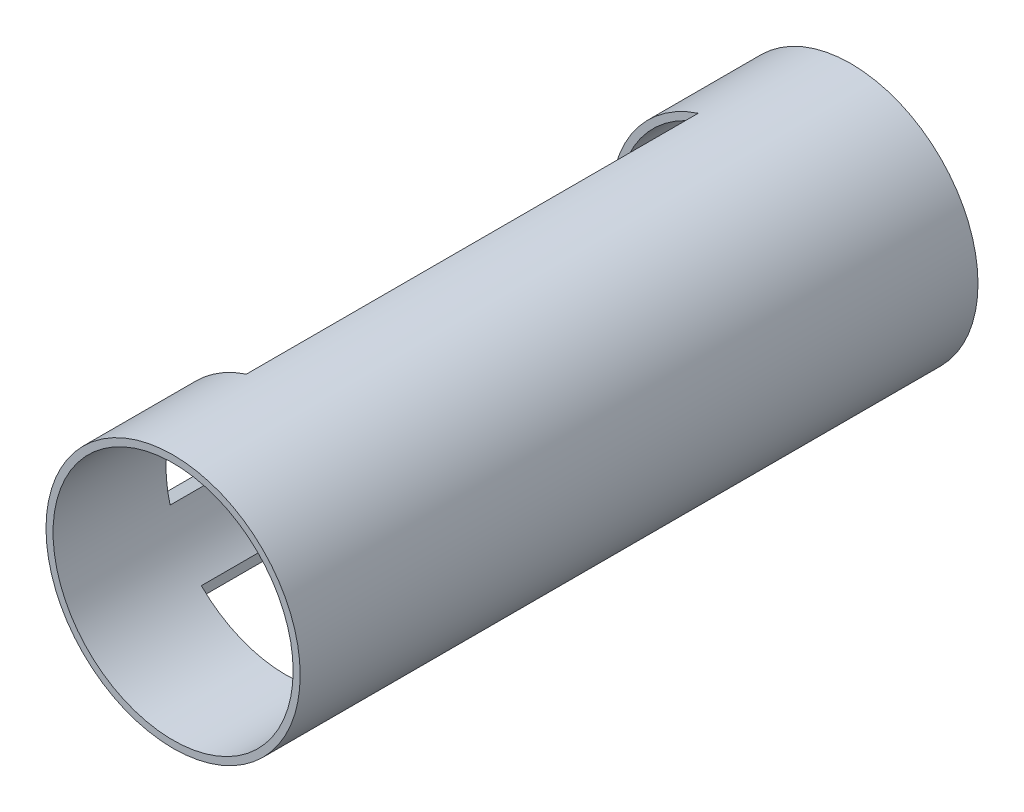
ISO-10303-21;
HEADER;
FILE_DESCRIPTION(('STEP AP214'),'2;1');
FILE_NAME('part.step','',(''),(''),'','','');
FILE_SCHEMA(('AUTOMOTIVE_DESIGN { 1 0 10303 214 1 1 1 1 }'));
ENDSEC;
DATA;
#1=APPLICATION_CONTEXT('core data for automotive mechanical design processes');
#2=APPLICATION_PROTOCOL_DEFINITION('international standard','automotive_design',2000,#1);
#3=PRODUCT_CONTEXT('',#1,'mechanical');
#4=PRODUCT('Part','Part','',(#3));
#5=PRODUCT_RELATED_PRODUCT_CATEGORY('part','',(#4));
#6=PRODUCT_DEFINITION_FORMATION('','',#4);
#7=PRODUCT_DEFINITION_CONTEXT('part definition',#1,'design');
#8=PRODUCT_DEFINITION('design','',#6,#7);
#9=PRODUCT_DEFINITION_SHAPE('','',#8);
#10=(LENGTH_UNIT() NAMED_UNIT(*) SI_UNIT(.MILLI.,.METRE.));
#11=(NAMED_UNIT(*) PLANE_ANGLE_UNIT() SI_UNIT($,.RADIAN.));
#12=(NAMED_UNIT(*) SI_UNIT($,.STERADIAN.) SOLID_ANGLE_UNIT());
#13=UNCERTAINTY_MEASURE_WITH_UNIT(LENGTH_MEASURE(1.E-05),#10,'distance_accuracy_value','');
#14=(GEOMETRIC_REPRESENTATION_CONTEXT(3) GLOBAL_UNCERTAINTY_ASSIGNED_CONTEXT((#13)) GLOBAL_UNIT_ASSIGNED_CONTEXT((#10,
#11,#12)) REPRESENTATION_CONTEXT('',''));
#15=CARTESIAN_POINT('',(0.,0.,0.));
#16=DIRECTION('',(0.,0.,1.));
#17=DIRECTION('',(1.,0.,0.));
#18=AXIS2_PLACEMENT_3D('',#15,#16,#17);
#19=CARTESIAN_POINT('',(0.,0.,304.8));
#20=DIRECTION('',(0.,0.,1.));
#21=DIRECTION('',(1.,0.,0.));
#22=AXIS2_PLACEMENT_3D('',#19,#20,#21);
#23=PLANE('',#22);
#24=CARTESIAN_POINT('',(0.,0.,304.8));
#25=DIRECTION('',(0.,0.,1.));
#26=DIRECTION('',(1.,0.,0.));
#27=AXIS2_PLACEMENT_3D('',#24,#25,#26);
#28=CIRCLE('',#27,57.15);
#29=CARTESIAN_POINT('',(57.15,0.,304.8));
#30=VERTEX_POINT('',#29);
#31=EDGE_CURVE('E144',#30,#30,#28,.T.);
#32=ORIENTED_EDGE('',*,*,#31,.T.);
#33=EDGE_LOOP('',(#32));
#34=FACE_BOUND('',#33,.T.);
#35=CARTESIAN_POINT('',(0.,0.,304.8));
#36=DIRECTION('',(0.,0.,1.));
#37=DIRECTION('',(1.,0.,0.));
#38=AXIS2_PLACEMENT_3D('',#35,#36,#37);
#39=CIRCLE('',#38,53.975);
#40=CARTESIAN_POINT('',(53.975,0.,304.8));
#41=VERTEX_POINT('',#40);
#42=EDGE_CURVE('E138',#41,#41,#39,.T.);
#43=ORIENTED_EDGE('',*,*,#42,.F.);
#44=EDGE_LOOP('',(#43));
#45=FACE_BOUND('',#44,.T.);
#46=ADVANCED_FACE('F32',(#34,#45),#23,.T.);
#47=CARTESIAN_POINT('',(0.,0.,0.));
#48=DIRECTION('',(0.,0.,1.));
#49=DIRECTION('',(1.,0.,0.));
#50=AXIS2_PLACEMENT_3D('',#47,#48,#49);
#51=PLANE('',#50);
#52=CARTESIAN_POINT('',(0.,0.,0.));
#53=DIRECTION('',(0.,0.,1.));
#54=DIRECTION('',(1.,0.,0.));
#55=AXIS2_PLACEMENT_3D('',#52,#53,#54);
#56=CIRCLE('',#55,57.15);
#57=CARTESIAN_POINT('',(57.15,0.,0.));
#58=VERTEX_POINT('',#57);
#59=EDGE_CURVE('E141',#58,#58,#56,.T.);
#60=ORIENTED_EDGE('',*,*,#59,.F.);
#61=EDGE_LOOP('',(#60));
#62=FACE_BOUND('',#61,.T.);
#63=CARTESIAN_POINT('',(0.,0.,0.));
#64=DIRECTION('',(0.,0.,1.));
#65=DIRECTION('',(1.,0.,0.));
#66=AXIS2_PLACEMENT_3D('',#63,#64,#65);
#67=CIRCLE('',#66,53.975);
#68=CARTESIAN_POINT('',(53.975,0.,0.));
#69=VERTEX_POINT('',#68);
#70=EDGE_CURVE('E137',#69,#69,#67,.T.);
#71=ORIENTED_EDGE('',*,*,#70,.T.);
#72=EDGE_LOOP('',(#71));
#73=FACE_BOUND('',#72,.T.);
#74=ADVANCED_FACE('F185',(#62,#73),#51,.F.);
#75=CARTESIAN_POINT('',(0.,0.,304.8));
#76=DIRECTION('',(0.,0.,-1.));
#77=DIRECTION('',(-1.,0.,0.));
#78=AXIS2_PLACEMENT_3D('',#75,#76,#77);
#79=CYLINDRICAL_SURFACE('',#78,57.15);
#80=DIRECTION('',(0.,0.,-1.));
#81=VECTOR('',#80,1.);
#82=CARTESIAN_POINT('',(-55.9401663726257,-11.6970203985014,304.8));
#83=LINE('',#82,#81);
#84=CARTESIAN_POINT('',(-55.9401663726257,-11.6970203985014,254.));
#85=VERTEX_POINT('',#84);
#86=CARTESIAN_POINT('',(-55.9401663726257,-11.6970203985014,50.8));
#87=VERTEX_POINT('',#86);
#88=EDGE_CURVE('E111',#85,#87,#83,.T.);
#89=ORIENTED_EDGE('',*,*,#88,.T.);
#90=CARTESIAN_POINT('',(0.,0.,50.8));
#91=DIRECTION('',(0.,0.,-1.));
#92=DIRECTION('',(-1.,0.,0.));
#93=AXIS2_PLACEMENT_3D('',#90,#91,#92);
#94=CIRCLE('',#93,57.15);
#95=CARTESIAN_POINT('',(-17.8401663726253,54.2941153698727,50.8));
#96=VERTEX_POINT('',#95);
#97=EDGE_CURVE('E104',#87,#96,#94,.T.);
#98=ORIENTED_EDGE('',*,*,#97,.T.);
#99=DIRECTION('',(0.,0.,-1.));
#100=VECTOR('',#99,1.);
#101=CARTESIAN_POINT('',(-17.8401663726253,54.2941153698727,304.8));
#102=LINE('',#101,#100);
#103=CARTESIAN_POINT('',(-17.8401663726253,54.2941153698727,254.));
#104=VERTEX_POINT('',#103);
#105=EDGE_CURVE('E93',#96,#104,#102,.F.);
#106=ORIENTED_EDGE('',*,*,#105,.T.);
#107=CARTESIAN_POINT('',(0.,0.,254.));
#108=DIRECTION('',(0.,0.,1.));
#109=DIRECTION('',(1.,0.,0.));
#110=AXIS2_PLACEMENT_3D('',#107,#108,#109);
#111=CIRCLE('',#110,57.15);
#112=EDGE_CURVE('E98',#104,#85,#111,.T.);
#113=ORIENTED_EDGE('',*,*,#112,.T.);
#114=EDGE_LOOP('',(#89,#98,#106,#113));
#115=FACE_BOUND('',#114,.T.);
#116=DIRECTION('',(0.,0.,-1.));
#117=VECTOR('',#116,1.);
#118=CARTESIAN_POINT('',(-38.1,-42.597094971371,304.8));
#119=LINE('',#118,#117);
#120=CARTESIAN_POINT('',(-38.1,-42.597094971371,50.8));
#121=VERTEX_POINT('',#120);
#122=CARTESIAN_POINT('',(-38.1,-42.597094971371,254.));
#123=VERTEX_POINT('',#122);
#124=EDGE_CURVE('E134',#121,#123,#119,.F.);
#125=ORIENTED_EDGE('',*,*,#124,.T.);
#126=CARTESIAN_POINT('',(0.,0.,254.));
#127=DIRECTION('',(0.,0.,1.));
#128=DIRECTION('',(1.,0.,0.));
#129=AXIS2_PLACEMENT_3D('',#126,#127,#128);
#130=CIRCLE('',#129,57.15);
#131=CARTESIAN_POINT('',(38.1,-42.597094971371,254.));
#132=VERTEX_POINT('',#131);
#133=EDGE_CURVE('E122',#123,#132,#130,.T.);
#134=ORIENTED_EDGE('',*,*,#133,.T.);
#135=DIRECTION('',(0.,0.,-1.));
#136=VECTOR('',#135,1.);
#137=CARTESIAN_POINT('',(38.1,-42.597094971371,304.8));
#138=LINE('',#137,#136);
#139=CARTESIAN_POINT('',(38.1,-42.597094971371,50.8));
#140=VERTEX_POINT('',#139);
#141=EDGE_CURVE('E129',#132,#140,#138,.T.);
#142=ORIENTED_EDGE('',*,*,#141,.T.);
#143=CARTESIAN_POINT('',(0.,0.,50.8));
#144=DIRECTION('',(0.,0.,-1.));
#145=DIRECTION('',(-1.,0.,0.));
#146=AXIS2_PLACEMENT_3D('',#143,#144,#145);
#147=CIRCLE('',#146,57.15);
#148=EDGE_CURVE('E132',#140,#121,#147,.T.);
#149=ORIENTED_EDGE('',*,*,#148,.T.);
#150=EDGE_LOOP('',(#125,#134,#142,#149));
#151=FACE_BOUND('',#150,.T.);
#152=ORIENTED_EDGE('',*,*,#31,.F.);
#153=EDGE_LOOP('',(#152));
#154=FACE_BOUND('',#153,.T.);
#155=ORIENTED_EDGE('',*,*,#59,.T.);
#156=EDGE_LOOP('',(#155));
#157=FACE_BOUND('',#156,.T.);
#158=ADVANCED_FACE('F34',(#115,#151,#154,#157),#79,.T.);
#159=CARTESIAN_POINT('',(0.,0.,304.8));
#160=DIRECTION('',(0.,0.,-1.));
#161=DIRECTION('',(-1.,0.,0.));
#162=AXIS2_PLACEMENT_3D('',#159,#160,#161);
#163=CYLINDRICAL_SURFACE('',#162,53.975);
#164=CARTESIAN_POINT('',(0.,0.,50.8));
#165=DIRECTION('',(0.,0.,-1.));
#166=DIRECTION('',(-1.,0.,0.));
#167=AXIS2_PLACEMENT_3D('',#164,#165,#166);
#168=CIRCLE('',#167,53.975);
#169=CARTESIAN_POINT('',(-52.1599376132001,-13.8795364903541,50.8));
#170=VERTEX_POINT('',#169);
#171=CARTESIAN_POINT('',(-14.0599376131998,52.11159927802,50.8));
#172=VERTEX_POINT('',#171);
#173=EDGE_CURVE('E11',#170,#172,#168,.T.);
#174=ORIENTED_EDGE('',*,*,#173,.F.);
#175=DIRECTION('',(0.,0.,-1.));
#176=VECTOR('',#175,1.);
#177=CARTESIAN_POINT('',(-52.1599376132001,-13.8795364903541,304.8));
#178=LINE('',#177,#176);
#179=CARTESIAN_POINT('',(-52.1599376132001,-13.8795364903541,254.));
#180=VERTEX_POINT('',#179);
#181=EDGE_CURVE('E40',#180,#170,#178,.T.);
#182=ORIENTED_EDGE('',*,*,#181,.F.);
#183=CARTESIAN_POINT('',(0.,0.,254.));
#184=DIRECTION('',(0.,0.,1.));
#185=DIRECTION('',(1.,0.,0.));
#186=AXIS2_PLACEMENT_3D('',#183,#184,#185);
#187=CIRCLE('',#186,53.975);
#188=CARTESIAN_POINT('',(-14.0599376131998,52.1115992780199,254.));
#189=VERTEX_POINT('',#188);
#190=EDGE_CURVE('E160',#189,#180,#187,.T.);
#191=ORIENTED_EDGE('',*,*,#190,.F.);
#192=DIRECTION('',(0.,0.,-1.));
#193=VECTOR('',#192,1.);
#194=CARTESIAN_POINT('',(-14.0599376131998,52.11159927802,304.8));
#195=LINE('',#194,#193);
#196=EDGE_CURVE('E158',#172,#189,#195,.F.);
#197=ORIENTED_EDGE('',*,*,#196,.F.);
#198=EDGE_LOOP('',(#174,#182,#191,#197));
#199=FACE_BOUND('',#198,.T.);
#200=DIRECTION('',(0.,0.,-1.));
#201=VECTOR('',#200,1.);
#202=CARTESIAN_POINT('',(-38.1,-38.2320627876655,304.8));
#203=LINE('',#202,#201);
#204=CARTESIAN_POINT('',(-38.1,-38.2320627876655,50.8));
#205=VERTEX_POINT('',#204);
#206=CARTESIAN_POINT('',(-38.1,-38.2320627876655,254.));
#207=VERTEX_POINT('',#206);
#208=EDGE_CURVE('E155',#205,#207,#203,.F.);
#209=ORIENTED_EDGE('',*,*,#208,.F.);
#210=CARTESIAN_POINT('',(0.,0.,50.8));
#211=DIRECTION('',(0.,0.,-1.));
#212=DIRECTION('',(-1.,0.,0.));
#213=AXIS2_PLACEMENT_3D('',#210,#211,#212);
#214=CIRCLE('',#213,53.975);
#215=CARTESIAN_POINT('',(38.1,-38.2320627876655,50.8));
#216=VERTEX_POINT('',#215);
#217=EDGE_CURVE('E153',#216,#205,#214,.T.);
#218=ORIENTED_EDGE('',*,*,#217,.F.);
#219=DIRECTION('',(0.,0.,-1.));
#220=VECTOR('',#219,1.);
#221=CARTESIAN_POINT('',(38.1,-38.2320627876655,304.8));
#222=LINE('',#221,#220);
#223=CARTESIAN_POINT('',(38.1,-38.2320627876655,254.));
#224=VERTEX_POINT('',#223);
#225=EDGE_CURVE('E151',#224,#216,#222,.T.);
#226=ORIENTED_EDGE('',*,*,#225,.F.);
#227=CARTESIAN_POINT('',(0.,0.,254.));
#228=DIRECTION('',(0.,0.,1.));
#229=DIRECTION('',(1.,0.,0.));
#230=AXIS2_PLACEMENT_3D('',#227,#228,#229);
#231=CIRCLE('',#230,53.975);
#232=EDGE_CURVE('E147',#207,#224,#231,.T.);
#233=ORIENTED_EDGE('',*,*,#232,.F.);
#234=EDGE_LOOP('',(#209,#218,#226,#233));
#235=FACE_BOUND('',#234,.T.);
#236=ORIENTED_EDGE('',*,*,#42,.T.);
#237=EDGE_LOOP('',(#236));
#238=FACE_BOUND('',#237,.T.);
#239=ORIENTED_EDGE('',*,*,#70,.F.);
#240=EDGE_LOOP('',(#239));
#241=FACE_BOUND('',#240,.T.);
#242=ADVANCED_FACE('F170',(#199,#235,#238,#241),#163,.F.);
#243=CARTESIAN_POINT('',(-38.1,-57.15,50.8));
#244=DIRECTION('',(-1.,0.,0.));
#245=DIRECTION('',(0.,0.,1.));
#246=AXIS2_PLACEMENT_3D('',#243,#244,#245);
#247=PLANE('',#246);
#248=DIRECTION('',(0.,1.,0.));
#249=VECTOR('',#248,1.);
#250=CARTESIAN_POINT('',(-38.1,-57.15,50.8));
#251=LINE('',#250,#249);
#252=EDGE_CURVE('E119',#121,#205,#251,.T.);
#253=ORIENTED_EDGE('',*,*,#252,.T.);
#254=ORIENTED_EDGE('',*,*,#208,.T.);
#255=DIRECTION('',(0.,1.,0.));
#256=VECTOR('',#255,1.);
#257=CARTESIAN_POINT('',(-38.1,-57.15,254.));
#258=LINE('',#257,#256);
#259=EDGE_CURVE('E112',#123,#207,#258,.T.);
#260=ORIENTED_EDGE('',*,*,#259,.F.);
#261=ORIENTED_EDGE('',*,*,#124,.F.);
#262=EDGE_LOOP('',(#253,#254,#260,#261));
#263=FACE_BOUND('',#262,.T.);
#264=ADVANCED_FACE('F196',(#263),#247,.F.);
#265=CARTESIAN_POINT('',(-38.1,-57.15,50.8));
#266=DIRECTION('',(0.,0.,-1.));
#267=DIRECTION('',(-1.,0.,0.));
#268=AXIS2_PLACEMENT_3D('',#265,#266,#267);
#269=PLANE('',#268);
#270=DIRECTION('',(0.,1.,0.));
#271=VECTOR('',#270,1.);
#272=CARTESIAN_POINT('',(38.1,-57.15,50.8));
#273=LINE('',#272,#271);
#274=EDGE_CURVE('E123',#140,#216,#273,.T.);
#275=ORIENTED_EDGE('',*,*,#274,.T.);
#276=ORIENTED_EDGE('',*,*,#217,.T.);
#277=ORIENTED_EDGE('',*,*,#252,.F.);
#278=ORIENTED_EDGE('',*,*,#148,.F.);
#279=EDGE_LOOP('',(#275,#276,#277,#278));
#280=FACE_BOUND('',#279,.T.);
#281=ADVANCED_FACE('F199',(#280),#269,.F.);
#282=CARTESIAN_POINT('',(38.1,-57.15,50.8));
#283=DIRECTION('',(1.,0.,0.));
#284=DIRECTION('',(0.,0.,-1.));
#285=AXIS2_PLACEMENT_3D('',#282,#283,#284);
#286=PLANE('',#285);
#287=DIRECTION('',(0.,1.,0.));
#288=VECTOR('',#287,1.);
#289=CARTESIAN_POINT('',(38.1,-57.15,254.));
#290=LINE('',#289,#288);
#291=EDGE_CURVE('E114',#132,#224,#290,.T.);
#292=ORIENTED_EDGE('',*,*,#291,.T.);
#293=ORIENTED_EDGE('',*,*,#225,.T.);
#294=ORIENTED_EDGE('',*,*,#274,.F.);
#295=ORIENTED_EDGE('',*,*,#141,.F.);
#296=EDGE_LOOP('',(#292,#293,#294,#295));
#297=FACE_BOUND('',#296,.T.);
#298=ADVANCED_FACE('F204',(#297),#286,.F.);
#299=CARTESIAN_POINT('',(-38.1,-57.15,254.));
#300=DIRECTION('',(0.,0.,1.));
#301=DIRECTION('',(1.,0.,0.));
#302=AXIS2_PLACEMENT_3D('',#299,#300,#301);
#303=PLANE('',#302);
#304=ORIENTED_EDGE('',*,*,#259,.T.);
#305=ORIENTED_EDGE('',*,*,#232,.T.);
#306=ORIENTED_EDGE('',*,*,#291,.F.);
#307=ORIENTED_EDGE('',*,*,#133,.F.);
#308=EDGE_LOOP('',(#304,#305,#306,#307));
#309=FACE_BOUND('',#308,.T.);
#310=ADVANCED_FACE('F201',(#309),#303,.F.);
#311=CARTESIAN_POINT('',(-48.5591759131401,72.0297437973277,50.8));
#312=DIRECTION('',(0.,0.,-1.));
#313=DIRECTION('',(-1.,0.,0.));
#314=AXIS2_PLACEMENT_3D('',#311,#312,#313);
#315=PLANE('',#314);
#316=DIRECTION('',(0.866025403784436,-0.500000000000004,0.));
#317=VECTOR('',#316,1.);
#318=CARTESIAN_POINT('',(-86.6591759131404,6.03860802895367,50.8));
#319=LINE('',#318,#317);
#320=EDGE_CURVE('E99',#87,#170,#319,.T.);
#321=ORIENTED_EDGE('',*,*,#320,.T.);
#322=ORIENTED_EDGE('',*,*,#173,.T.);
#323=DIRECTION('',(0.866025403784436,-0.500000000000004,0.));
#324=VECTOR('',#323,1.);
#325=CARTESIAN_POINT('',(-48.5591759131401,72.0297437973277,50.8));
#326=LINE('',#325,#324);
#327=EDGE_CURVE('E52',#96,#172,#326,.T.);
#328=ORIENTED_EDGE('',*,*,#327,.F.);
#329=ORIENTED_EDGE('',*,*,#97,.F.);
#330=EDGE_LOOP('',(#321,#322,#328,#329));
#331=FACE_BOUND('',#330,.T.);
#332=ADVANCED_FACE('F103',(#331),#315,.F.);
#333=CARTESIAN_POINT('',(-86.6591759131404,6.03860802895367,50.8));
#334=DIRECTION('',(-0.500000000000004,-0.866025403784436,0.));
#335=DIRECTION('',(0.866025403784436,-0.500000000000004,0.));
#336=AXIS2_PLACEMENT_3D('',#333,#334,#335);
#337=PLANE('',#336);
#338=DIRECTION('',(0.866025403784436,-0.500000000000004,0.));
#339=VECTOR('',#338,1.);
#340=CARTESIAN_POINT('',(-86.6591759131404,6.03860802895367,254.));
#341=LINE('',#340,#339);
#342=EDGE_CURVE('E166',#85,#180,#341,.T.);
#343=ORIENTED_EDGE('',*,*,#342,.T.);
#344=ORIENTED_EDGE('',*,*,#181,.T.);
#345=ORIENTED_EDGE('',*,*,#320,.F.);
#346=ORIENTED_EDGE('',*,*,#88,.F.);
#347=EDGE_LOOP('',(#343,#344,#345,#346));
#348=FACE_BOUND('',#347,.T.);
#349=ADVANCED_FACE('F164',(#348),#337,.F.);
#350=CARTESIAN_POINT('',(-48.5591759131401,72.0297437973277,254.));
#351=DIRECTION('',(0.,0.,1.));
#352=DIRECTION('',(1.,0.,0.));
#353=AXIS2_PLACEMENT_3D('',#350,#351,#352);
#354=PLANE('',#353);
#355=DIRECTION('',(0.866025403784436,-0.500000000000004,0.));
#356=VECTOR('',#355,1.);
#357=CARTESIAN_POINT('',(-48.5591759131401,72.0297437973277,254.));
#358=LINE('',#357,#356);
#359=EDGE_CURVE('E47',#104,#189,#358,.T.);
#360=ORIENTED_EDGE('',*,*,#359,.T.);
#361=ORIENTED_EDGE('',*,*,#190,.T.);
#362=ORIENTED_EDGE('',*,*,#342,.F.);
#363=ORIENTED_EDGE('',*,*,#112,.F.);
#364=EDGE_LOOP('',(#360,#361,#362,#363));
#365=FACE_BOUND('',#364,.T.);
#366=ADVANCED_FACE('F173',(#365),#354,.F.);
#367=CARTESIAN_POINT('',(-48.5591759131401,72.0297437973277,50.8));
#368=DIRECTION('',(0.500000000000004,0.866025403784436,0.));
#369=DIRECTION('',(-0.866025403784436,0.500000000000004,0.));
#370=AXIS2_PLACEMENT_3D('',#367,#368,#369);
#371=PLANE('',#370);
#372=ORIENTED_EDGE('',*,*,#327,.T.);
#373=ORIENTED_EDGE('',*,*,#196,.T.);
#374=ORIENTED_EDGE('',*,*,#359,.F.);
#375=ORIENTED_EDGE('',*,*,#105,.F.);
#376=EDGE_LOOP('',(#372,#373,#374,#375));
#377=FACE_BOUND('',#376,.T.);
#378=ADVANCED_FACE('F94',(#377),#371,.F.);
#379=CLOSED_SHELL('',(#46,#74,#158,#242,#264,#281,#298,#310,#332,#349,#366,#378));
#380=MANIFOLD_SOLID_BREP('B2',#379);
#381=ADVANCED_BREP_SHAPE_REPRESENTATION('',(#18,#380),#14);
#382=SHAPE_DEFINITION_REPRESENTATION(#9,#381);
ENDSEC;
END-ISO-10303-21;
